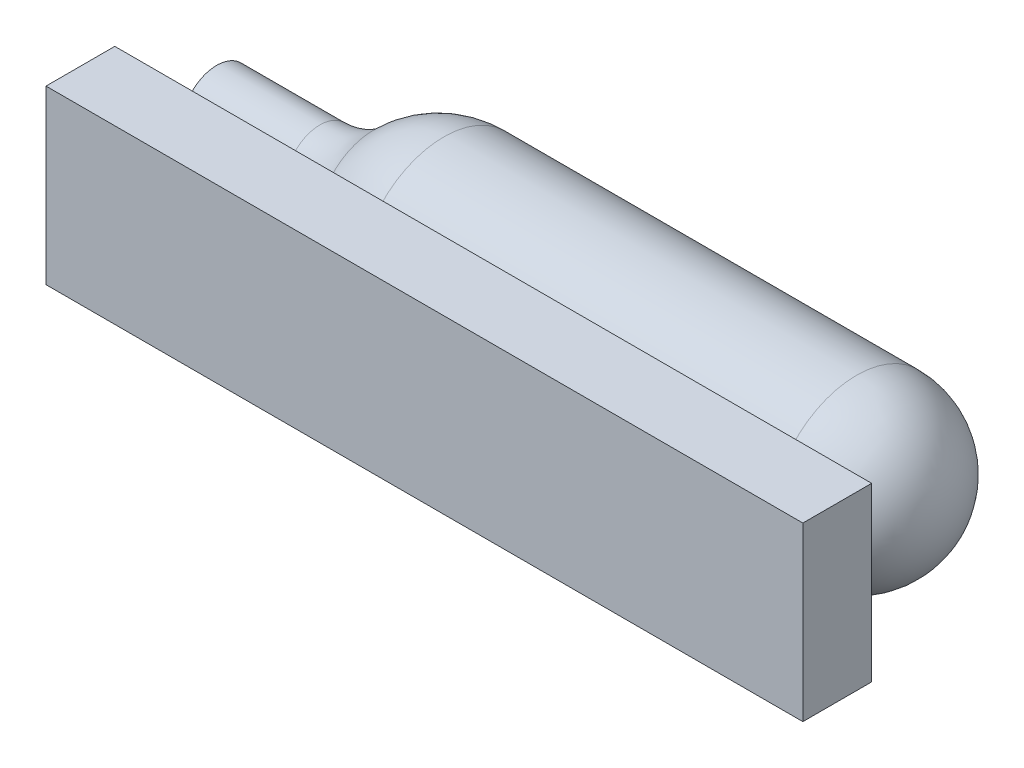
ISO-10303-21;
HEADER;
FILE_DESCRIPTION(('STEP AP214'),'2;1');
FILE_NAME('part.step','',(''),(''),'','','');
FILE_SCHEMA(('AUTOMOTIVE_DESIGN { 1 0 10303 214 1 1 1 1 }'));
ENDSEC;
DATA;
#1=APPLICATION_CONTEXT('core data for automotive mechanical design processes');
#2=APPLICATION_PROTOCOL_DEFINITION('international standard','automotive_design',2000,#1);
#3=PRODUCT_CONTEXT('',#1,'mechanical');
#4=PRODUCT('Part','Part','',(#3));
#5=PRODUCT_RELATED_PRODUCT_CATEGORY('part','',(#4));
#6=PRODUCT_DEFINITION_FORMATION('','',#4);
#7=PRODUCT_DEFINITION_CONTEXT('part definition',#1,'design');
#8=PRODUCT_DEFINITION('design','',#6,#7);
#9=PRODUCT_DEFINITION_SHAPE('','',#8);
#10=(LENGTH_UNIT() NAMED_UNIT(*) SI_UNIT(.MILLI.,.METRE.));
#11=(NAMED_UNIT(*) PLANE_ANGLE_UNIT() SI_UNIT($,.RADIAN.));
#12=(NAMED_UNIT(*) SI_UNIT($,.STERADIAN.) SOLID_ANGLE_UNIT());
#13=UNCERTAINTY_MEASURE_WITH_UNIT(LENGTH_MEASURE(1.E-05),#10,'distance_accuracy_value','');
#14=(GEOMETRIC_REPRESENTATION_CONTEXT(3) GLOBAL_UNCERTAINTY_ASSIGNED_CONTEXT((#13)) GLOBAL_UNIT_ASSIGNED_CONTEXT((#10,
#11,#12)) REPRESENTATION_CONTEXT('',''));
#15=CARTESIAN_POINT('',(0.,0.,0.));
#16=DIRECTION('',(0.,0.,1.));
#17=DIRECTION('',(1.,0.,0.));
#18=AXIS2_PLACEMENT_3D('',#15,#16,#17);
#19=CARTESIAN_POINT('',(-170.18,-51.308,57.15));
#20=DIRECTION('',(1.,0.,0.));
#21=DIRECTION('',(0.,0.,-1.));
#22=AXIS2_PLACEMENT_3D('',#19,#20,#21);
#23=PLANE('',#22);
#24=DIRECTION('',(0.,-1.,0.));
#25=VECTOR('',#24,1.);
#26=CARTESIAN_POINT('',(-170.18,-51.308,31.75));
#27=LINE('',#26,#25);
#28=CARTESIAN_POINT('',(-170.18,12.192,31.75));
#29=VERTEX_POINT('',#28);
#30=CARTESIAN_POINT('',(-170.18,-51.308,31.75));
#31=VERTEX_POINT('',#30);
#32=EDGE_CURVE('E108',#29,#31,#27,.T.);
#33=ORIENTED_EDGE('',*,*,#32,.T.);
#34=DIRECTION('',(0.,0.,-1.));
#35=VECTOR('',#34,1.);
#36=CARTESIAN_POINT('',(-170.18,-51.308,57.15));
#37=LINE('',#36,#35);
#38=CARTESIAN_POINT('',(-170.18,-51.308,57.15));
#39=VERTEX_POINT('',#38);
#40=EDGE_CURVE('E12',#39,#31,#37,.T.);
#41=ORIENTED_EDGE('',*,*,#40,.F.);
#42=DIRECTION('',(0.,-1.,0.));
#43=VECTOR('',#42,1.);
#44=CARTESIAN_POINT('',(-170.18,-51.308,57.15));
#45=LINE('',#44,#43);
#46=CARTESIAN_POINT('',(-170.18,12.192,57.15));
#47=VERTEX_POINT('',#46);
#48=EDGE_CURVE('E96',#47,#39,#45,.T.);
#49=ORIENTED_EDGE('',*,*,#48,.F.);
#50=DIRECTION('',(0.,0.,-1.));
#51=VECTOR('',#50,1.);
#52=CARTESIAN_POINT('',(-170.18,12.192,57.15));
#53=LINE('',#52,#51);
#54=EDGE_CURVE('E104',#47,#29,#53,.T.);
#55=ORIENTED_EDGE('',*,*,#54,.T.);
#56=EDGE_LOOP('',(#33,#41,#49,#55));
#57=FACE_BOUND('',#56,.T.);
#58=ADVANCED_FACE('F45',(#57),#23,.F.);
#59=CARTESIAN_POINT('',(-170.18,-51.308,57.15));
#60=DIRECTION('',(0.,1.,0.));
#61=DIRECTION('',(0.,0.,1.));
#62=AXIS2_PLACEMENT_3D('',#59,#60,#61);
#63=PLANE('',#62);
#64=DIRECTION('',(1.,0.,0.));
#65=VECTOR('',#64,1.);
#66=CARTESIAN_POINT('',(-170.18,-51.308,31.75));
#67=LINE('',#66,#65);
#68=CARTESIAN_POINT('',(109.22,-51.308,31.75));
#69=VERTEX_POINT('',#68);
#70=EDGE_CURVE('E100',#31,#69,#67,.T.);
#71=ORIENTED_EDGE('',*,*,#70,.T.);
#72=DIRECTION('',(0.,0.,-1.));
#73=VECTOR('',#72,1.);
#74=CARTESIAN_POINT('',(109.22,-51.308,57.15));
#75=LINE('',#74,#73);
#76=CARTESIAN_POINT('',(109.22,-51.308,57.15));
#77=VERTEX_POINT('',#76);
#78=EDGE_CURVE('E53',#77,#69,#75,.T.);
#79=ORIENTED_EDGE('',*,*,#78,.F.);
#80=DIRECTION('',(1.,0.,0.));
#81=VECTOR('',#80,1.);
#82=CARTESIAN_POINT('',(-170.18,-51.308,57.15));
#83=LINE('',#82,#81);
#84=EDGE_CURVE('E91',#39,#77,#83,.T.);
#85=ORIENTED_EDGE('',*,*,#84,.F.);
#86=ORIENTED_EDGE('',*,*,#40,.T.);
#87=EDGE_LOOP('',(#71,#79,#85,#86));
#88=FACE_BOUND('',#87,.T.);
#89=ADVANCED_FACE('F99',(#88),#63,.F.);
#90=CARTESIAN_POINT('',(109.22,-51.308,57.15));
#91=DIRECTION('',(-1.,0.,0.));
#92=DIRECTION('',(0.,0.,1.));
#93=AXIS2_PLACEMENT_3D('',#90,#91,#92);
#94=PLANE('',#93);
#95=DIRECTION('',(0.,1.,0.));
#96=VECTOR('',#95,1.);
#97=CARTESIAN_POINT('',(109.22,-51.308,31.75));
#98=LINE('',#97,#96);
#99=CARTESIAN_POINT('',(109.22,12.192,31.75));
#100=VERTEX_POINT('',#99);
#101=EDGE_CURVE('E78',#69,#100,#98,.T.);
#102=ORIENTED_EDGE('',*,*,#101,.T.);
#103=DIRECTION('',(0.,0.,-1.));
#104=VECTOR('',#103,1.);
#105=CARTESIAN_POINT('',(109.22,12.192,57.15));
#106=LINE('',#105,#104);
#107=CARTESIAN_POINT('',(109.22,12.192,57.15));
#108=VERTEX_POINT('',#107);
#109=EDGE_CURVE('E101',#108,#100,#106,.T.);
#110=ORIENTED_EDGE('',*,*,#109,.F.);
#111=DIRECTION('',(0.,1.,0.));
#112=VECTOR('',#111,1.);
#113=CARTESIAN_POINT('',(109.22,-51.308,57.15));
#114=LINE('',#113,#112);
#115=EDGE_CURVE('E94',#77,#108,#114,.T.);
#116=ORIENTED_EDGE('',*,*,#115,.F.);
#117=ORIENTED_EDGE('',*,*,#78,.T.);
#118=EDGE_LOOP('',(#102,#110,#116,#117));
#119=FACE_BOUND('',#118,.T.);
#120=ADVANCED_FACE('F102',(#119),#94,.F.);
#121=CARTESIAN_POINT('',(-170.18,12.192,57.15));
#122=DIRECTION('',(0.,-1.,0.));
#123=DIRECTION('',(0.,0.,-1.));
#124=AXIS2_PLACEMENT_3D('',#121,#122,#123);
#125=PLANE('',#124);
#126=DIRECTION('',(-1.,0.,0.));
#127=VECTOR('',#126,1.);
#128=CARTESIAN_POINT('',(-170.18,12.192,31.75));
#129=LINE('',#128,#127);
#130=EDGE_CURVE('E84',#100,#29,#129,.T.);
#131=ORIENTED_EDGE('',*,*,#130,.T.);
#132=ORIENTED_EDGE('',*,*,#54,.F.);
#133=DIRECTION('',(-1.,0.,0.));
#134=VECTOR('',#133,1.);
#135=CARTESIAN_POINT('',(-170.18,12.192,57.15));
#136=LINE('',#135,#134);
#137=EDGE_CURVE('E61',#108,#47,#136,.T.);
#138=ORIENTED_EDGE('',*,*,#137,.F.);
#139=ORIENTED_EDGE('',*,*,#109,.T.);
#140=EDGE_LOOP('',(#131,#132,#138,#139));
#141=FACE_BOUND('',#140,.T.);
#142=ADVANCED_FACE('F115',(#141),#125,.F.);
#143=CARTESIAN_POINT('',(0.,0.,57.15));
#144=DIRECTION('',(0.,0.,-1.));
#145=DIRECTION('',(-1.,0.,0.));
#146=AXIS2_PLACEMENT_3D('',#143,#144,#145);
#147=PLANE('',#146);
#148=ORIENTED_EDGE('',*,*,#48,.T.);
#149=ORIENTED_EDGE('',*,*,#84,.T.);
#150=ORIENTED_EDGE('',*,*,#115,.T.);
#151=ORIENTED_EDGE('',*,*,#137,.T.);
#152=EDGE_LOOP('',(#148,#149,#150,#151));
#153=FACE_BOUND('',#152,.T.);
#154=ADVANCED_FACE('F92',(#153),#147,.F.);
#155=CARTESIAN_POINT('',(0.,0.,31.75));
#156=DIRECTION('',(0.,0.,-1.));
#157=DIRECTION('',(-1.,0.,0.));
#158=AXIS2_PLACEMENT_3D('',#155,#156,#157);
#159=PLANE('',#158);
#160=ORIENTED_EDGE('',*,*,#32,.F.);
#161=ORIENTED_EDGE('',*,*,#130,.F.);
#162=ORIENTED_EDGE('',*,*,#101,.F.);
#163=ORIENTED_EDGE('',*,*,#70,.F.);
#164=EDGE_LOOP('',(#160,#161,#162,#163));
#165=FACE_BOUND('',#164,.T.);
#166=ADVANCED_FACE('F118',(#165),#159,.T.);
#167=CLOSED_SHELL('',(#58,#89,#120,#142,#154,#166));
#168=MANIFOLD_SOLID_BREP('B2',#167);
#169=CARTESIAN_POINT('',(-80.4825115796759,-19.5203018667575,0.));
#170=DIRECTION('',(-1.,0.,0.));
#171=DIRECTION('',(0.,0.,1.));
#172=AXIS2_PLACEMENT_3D('',#169,#170,#171);
#173=DEGENERATE_TOROIDAL_SURFACE('',#172,4.75704814575991,36.5070481457599,.F.);
#174=CARTESIAN_POINT('',(-106.395004854255,-19.5203018667575,0.));
#175=DIRECTION('',(-1.,0.,0.));
#176=DIRECTION('',(0.,0.,1.));
#177=AXIS2_PLACEMENT_3D('',#174,#175,#176);
#178=CIRCLE('',#177,20.9588468729188);
#179=CARTESIAN_POINT('',(-106.395004854255,-19.5203018667575,20.9588468729188));
#180=VERTEX_POINT('',#179);
#181=EDGE_CURVE('E44',#180,#180,#178,.T.);
#182=ORIENTED_EDGE('',*,*,#181,.F.);
#183=EDGE_LOOP('',(#182));
#184=FACE_BOUND('',#183,.T.);
#185=CARTESIAN_POINT('',(-80.4825115796759,-19.5203018667575,0.));
#186=DIRECTION('',(-1.,0.,0.));
#187=DIRECTION('',(0.,0.,1.));
#188=AXIS2_PLACEMENT_3D('',#185,#186,#187);
#189=CIRCLE('',#188,31.75);
#190=CARTESIAN_POINT('',(-80.4825115796759,-19.5203018667575,31.75));
#191=VERTEX_POINT('',#190);
#192=EDGE_CURVE('E188',#191,#191,#189,.T.);
#193=ORIENTED_EDGE('',*,*,#192,.T.);
#194=EDGE_LOOP('',(#193));
#195=FACE_BOUND('',#194,.T.);
#196=ADVANCED_FACE('F169',(#184,#195),#173,.F.);
#197=CARTESIAN_POINT('',(-126.226742160737,-19.5203018667575,0.));
#198=DIRECTION('',(-1.,0.,0.));
#199=DIRECTION('',(0.,0.,1.));
#200=AXIS2_PLACEMENT_3D('',#197,#198,#199);
#201=TOROIDAL_SURFACE('',#200,40.6401206587879,27.9401206587879);
#202=CARTESIAN_POINT('',(-126.226742160737,-19.5203018667575,0.));
#203=DIRECTION('',(-1.,0.,0.));
#204=DIRECTION('',(0.,0.,1.));
#205=AXIS2_PLACEMENT_3D('',#202,#203,#204);
#206=CIRCLE('',#205,12.7);
#207=CARTESIAN_POINT('',(-126.226742160737,-19.5203018667575,12.7));
#208=VERTEX_POINT('',#207);
#209=EDGE_CURVE('E175',#208,#208,#206,.T.);
#210=ORIENTED_EDGE('',*,*,#209,.F.);
#211=EDGE_LOOP('',(#210));
#212=FACE_BOUND('',#211,.T.);
#213=ORIENTED_EDGE('',*,*,#181,.T.);
#214=EDGE_LOOP('',(#213));
#215=FACE_BOUND('',#214,.T.);
#216=ADVANCED_FACE('F210',(#212,#215),#201,.F.);
#217=CARTESIAN_POINT('',(-164.326742160737,-19.5203018667575,0.));
#218=DIRECTION('',(-1.,0.,0.));
#219=DIRECTION('',(0.,0.,1.));
#220=AXIS2_PLACEMENT_3D('',#217,#218,#219);
#221=CYLINDRICAL_SURFACE('',#220,12.7);
#222=CARTESIAN_POINT('',(-164.326742160737,-19.5203018667575,0.));
#223=DIRECTION('',(-1.,0.,0.));
#224=DIRECTION('',(0.,0.,1.));
#225=AXIS2_PLACEMENT_3D('',#222,#223,#224);
#226=CIRCLE('',#225,12.7);
#227=CARTESIAN_POINT('',(-164.326742160737,-19.5203018667575,12.7));
#228=VERTEX_POINT('',#227);
#229=EDGE_CURVE('E179',#228,#228,#226,.T.);
#230=ORIENTED_EDGE('',*,*,#229,.F.);
#231=EDGE_LOOP('',(#230));
#232=FACE_BOUND('',#231,.T.);
#233=ORIENTED_EDGE('',*,*,#209,.T.);
#234=EDGE_LOOP('',(#233));
#235=FACE_BOUND('',#234,.T.);
#236=ADVANCED_FACE('F206',(#232,#235),#221,.T.);
#237=CARTESIAN_POINT('',(-164.326742160737,-6.82030186675747,0.));
#238=DIRECTION('',(1.,0.,0.));
#239=DIRECTION('',(0.,0.,-1.));
#240=AXIS2_PLACEMENT_3D('',#237,#238,#239);
#241=PLANE('',#240);
#242=ORIENTED_EDGE('',*,*,#229,.T.);
#243=EDGE_LOOP('',(#242));
#244=FACE_BOUND('',#243,.T.);
#245=ADVANCED_FACE('F201',(#244),#241,.F.);
#246=CARTESIAN_POINT('',(71.9174884203241,-19.5203018667575,0.));
#247=DIRECTION('',(-1.,0.,0.));
#248=DIRECTION('',(0.,1.,0.));
#249=AXIS2_PLACEMENT_3D('',#246,#247,#248);
#250=SPHERICAL_SURFACE('',#249,31.75);
#251=CARTESIAN_POINT('',(71.9174884203241,-19.5203018667575,0.));
#252=DIRECTION('',(-1.,0.,0.));
#253=DIRECTION('',(0.,0.,1.));
#254=AXIS2_PLACEMENT_3D('',#251,#252,#253);
#255=CIRCLE('',#254,31.75);
#256=CARTESIAN_POINT('',(71.9174884203241,-19.5203018667575,31.75));
#257=VERTEX_POINT('',#256);
#258=EDGE_CURVE('E183',#257,#257,#255,.T.);
#259=ORIENTED_EDGE('',*,*,#258,.F.);
#260=EDGE_LOOP('',(#259));
#261=FACE_BOUND('',#260,.T.);
#262=ADVANCED_FACE('F196',(#261),#250,.T.);
#263=CARTESIAN_POINT('',(-164.326742160737,-19.5203018667575,0.));
#264=DIRECTION('',(-1.,0.,0.));
#265=DIRECTION('',(0.,0.,1.));
#266=AXIS2_PLACEMENT_3D('',#263,#264,#265);
#267=CYLINDRICAL_SURFACE('',#266,31.75);
#268=ORIENTED_EDGE('',*,*,#192,.F.);
#269=EDGE_LOOP('',(#268));
#270=FACE_BOUND('',#269,.T.);
#271=ORIENTED_EDGE('',*,*,#258,.T.);
#272=EDGE_LOOP('',(#271));
#273=FACE_BOUND('',#272,.T.);
#274=ADVANCED_FACE('F193',(#270,#273),#267,.T.);
#275=CLOSED_SHELL('',(#196,#216,#236,#245,#262,#274));
#276=MANIFOLD_SOLID_BREP('B6',#275);
#277=ADVANCED_BREP_SHAPE_REPRESENTATION('',(#18,#168,#276),#14);
#278=SHAPE_DEFINITION_REPRESENTATION(#9,#277);
ENDSEC;
END-ISO-10303-21;
